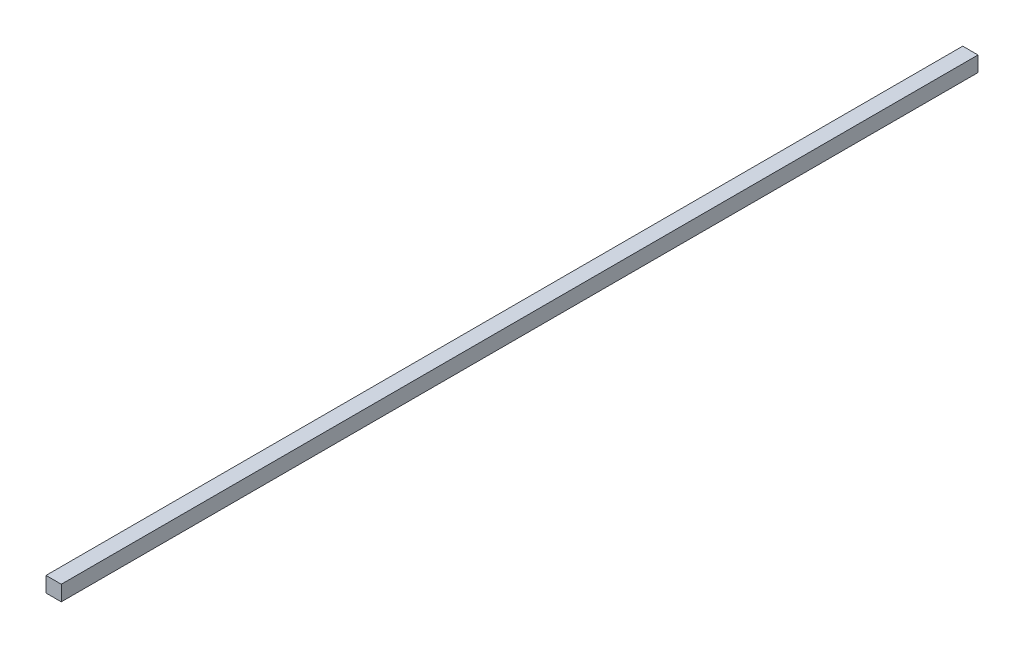
ISO-10303-21;
HEADER;
FILE_DESCRIPTION(('STEP AP214'),'2;1');
FILE_NAME('part.step','',(''),(''),'','','');
FILE_SCHEMA(('AUTOMOTIVE_DESIGN { 1 0 10303 214 1 1 1 1 }'));
ENDSEC;
DATA;
#1=APPLICATION_CONTEXT('core data for automotive mechanical design processes');
#2=APPLICATION_PROTOCOL_DEFINITION('international standard','automotive_design',2000,#1);
#3=PRODUCT_CONTEXT('',#1,'mechanical');
#4=PRODUCT('Part','Part','',(#3));
#5=PRODUCT_RELATED_PRODUCT_CATEGORY('part','',(#4));
#6=PRODUCT_DEFINITION_FORMATION('','',#4);
#7=PRODUCT_DEFINITION_CONTEXT('part definition',#1,'design');
#8=PRODUCT_DEFINITION('design','',#6,#7);
#9=PRODUCT_DEFINITION_SHAPE('','',#8);
#10=(LENGTH_UNIT() NAMED_UNIT(*) SI_UNIT(.MILLI.,.METRE.));
#11=(NAMED_UNIT(*) PLANE_ANGLE_UNIT() SI_UNIT($,.RADIAN.));
#12=(NAMED_UNIT(*) SI_UNIT($,.STERADIAN.) SOLID_ANGLE_UNIT());
#13=UNCERTAINTY_MEASURE_WITH_UNIT(LENGTH_MEASURE(1.E-05),#10,'distance_accuracy_value','');
#14=(GEOMETRIC_REPRESENTATION_CONTEXT(3) GLOBAL_UNCERTAINTY_ASSIGNED_CONTEXT((#13)) GLOBAL_UNIT_ASSIGNED_CONTEXT((#10,
#11,#12)) REPRESENTATION_CONTEXT('',''));
#15=CARTESIAN_POINT('',(0.,0.,0.));
#16=DIRECTION('',(0.,0.,1.));
#17=DIRECTION('',(1.,0.,0.));
#18=AXIS2_PLACEMENT_3D('',#15,#16,#17);
#19=CARTESIAN_POINT('',(0.,0.,600.));
#20=DIRECTION('',(1.,0.,0.));
#21=DIRECTION('',(0.,1.,0.));
#22=AXIS2_PLACEMENT_3D('',#19,#20,#21);
#23=PLANE('',#22);
#24=DIRECTION('',(0.,-1.,0.));
#25=VECTOR('',#24,1.);
#26=CARTESIAN_POINT('',(0.,0.,0.));
#27=LINE('',#26,#25);
#28=CARTESIAN_POINT('',(0.,0.,0.));
#29=VERTEX_POINT('',#28);
#30=CARTESIAN_POINT('',(0.,-10.,0.));
#31=VERTEX_POINT('',#30);
#32=EDGE_CURVE('E96',#29,#31,#27,.T.);
#33=ORIENTED_EDGE('',*,*,#32,.T.);
#34=DIRECTION('',(0.,0.,-1.));
#35=VECTOR('',#34,1.);
#36=CARTESIAN_POINT('',(0.,-10.,600.));
#37=LINE('',#36,#35);
#38=CARTESIAN_POINT('',(0.,-10.,600.));
#39=VERTEX_POINT('',#38);
#40=EDGE_CURVE('E11',#39,#31,#37,.T.);
#41=ORIENTED_EDGE('',*,*,#40,.F.);
#42=DIRECTION('',(0.,-1.,0.));
#43=VECTOR('',#42,1.);
#44=CARTESIAN_POINT('',(0.,0.,600.));
#45=LINE('',#44,#43);
#46=CARTESIAN_POINT('',(0.,0.,600.));
#47=VERTEX_POINT('',#46);
#48=EDGE_CURVE('E84',#47,#39,#45,.T.);
#49=ORIENTED_EDGE('',*,*,#48,.F.);
#50=DIRECTION('',(0.,0.,-1.));
#51=VECTOR('',#50,1.);
#52=CARTESIAN_POINT('',(0.,0.,600.));
#53=LINE('',#52,#51);
#54=EDGE_CURVE('E92',#47,#29,#53,.T.);
#55=ORIENTED_EDGE('',*,*,#54,.T.);
#56=EDGE_LOOP('',(#33,#41,#49,#55));
#57=FACE_BOUND('',#56,.T.);
#58=ADVANCED_FACE('F33',(#57),#23,.F.);
#59=CARTESIAN_POINT('',(0.,-10.,600.));
#60=DIRECTION('',(0.,1.,0.));
#61=DIRECTION('',(0.,0.,1.));
#62=AXIS2_PLACEMENT_3D('',#59,#60,#61);
#63=PLANE('',#62);
#64=DIRECTION('',(1.,0.,0.));
#65=VECTOR('',#64,1.);
#66=CARTESIAN_POINT('',(0.,-10.,0.));
#67=LINE('',#66,#65);
#68=CARTESIAN_POINT('',(10.,-10.,0.));
#69=VERTEX_POINT('',#68);
#70=EDGE_CURVE('E88',#31,#69,#67,.T.);
#71=ORIENTED_EDGE('',*,*,#70,.T.);
#72=DIRECTION('',(0.,0.,-1.));
#73=VECTOR('',#72,1.);
#74=CARTESIAN_POINT('',(10.,-10.,600.));
#75=LINE('',#74,#73);
#76=CARTESIAN_POINT('',(10.,-10.,600.));
#77=VERTEX_POINT('',#76);
#78=EDGE_CURVE('E41',#77,#69,#75,.T.);
#79=ORIENTED_EDGE('',*,*,#78,.F.);
#80=DIRECTION('',(1.,0.,0.));
#81=VECTOR('',#80,1.);
#82=CARTESIAN_POINT('',(0.,-10.,600.));
#83=LINE('',#82,#81);
#84=EDGE_CURVE('E79',#39,#77,#83,.T.);
#85=ORIENTED_EDGE('',*,*,#84,.F.);
#86=ORIENTED_EDGE('',*,*,#40,.T.);
#87=EDGE_LOOP('',(#71,#79,#85,#86));
#88=FACE_BOUND('',#87,.T.);
#89=ADVANCED_FACE('F87',(#88),#63,.F.);
#90=CARTESIAN_POINT('',(10.,0.,600.));
#91=DIRECTION('',(-1.,0.,0.));
#92=DIRECTION('',(0.,-1.,0.));
#93=AXIS2_PLACEMENT_3D('',#90,#91,#92);
#94=PLANE('',#93);
#95=DIRECTION('',(0.,1.,0.));
#96=VECTOR('',#95,1.);
#97=CARTESIAN_POINT('',(10.,0.,0.));
#98=LINE('',#97,#96);
#99=CARTESIAN_POINT('',(10.,0.,0.));
#100=VERTEX_POINT('',#99);
#101=EDGE_CURVE('E66',#69,#100,#98,.T.);
#102=ORIENTED_EDGE('',*,*,#101,.T.);
#103=DIRECTION('',(0.,0.,-1.));
#104=VECTOR('',#103,1.);
#105=CARTESIAN_POINT('',(10.,0.,600.));
#106=LINE('',#105,#104);
#107=CARTESIAN_POINT('',(10.,0.,600.));
#108=VERTEX_POINT('',#107);
#109=EDGE_CURVE('E89',#108,#100,#106,.T.);
#110=ORIENTED_EDGE('',*,*,#109,.F.);
#111=DIRECTION('',(0.,1.,0.));
#112=VECTOR('',#111,1.);
#113=CARTESIAN_POINT('',(10.,0.,600.));
#114=LINE('',#113,#112);
#115=EDGE_CURVE('E82',#77,#108,#114,.T.);
#116=ORIENTED_EDGE('',*,*,#115,.F.);
#117=ORIENTED_EDGE('',*,*,#78,.T.);
#118=EDGE_LOOP('',(#102,#110,#116,#117));
#119=FACE_BOUND('',#118,.T.);
#120=ADVANCED_FACE('F90',(#119),#94,.F.);
#121=CARTESIAN_POINT('',(0.,0.,600.));
#122=DIRECTION('',(0.,-1.,0.));
#123=DIRECTION('',(0.,0.,-1.));
#124=AXIS2_PLACEMENT_3D('',#121,#122,#123);
#125=PLANE('',#124);
#126=DIRECTION('',(-1.,0.,0.));
#127=VECTOR('',#126,1.);
#128=CARTESIAN_POINT('',(0.,0.,0.));
#129=LINE('',#128,#127);
#130=EDGE_CURVE('E72',#100,#29,#129,.T.);
#131=ORIENTED_EDGE('',*,*,#130,.T.);
#132=ORIENTED_EDGE('',*,*,#54,.F.);
#133=DIRECTION('',(-1.,0.,0.));
#134=VECTOR('',#133,1.);
#135=CARTESIAN_POINT('',(0.,0.,600.));
#136=LINE('',#135,#134);
#137=EDGE_CURVE('E49',#108,#47,#136,.T.);
#138=ORIENTED_EDGE('',*,*,#137,.F.);
#139=ORIENTED_EDGE('',*,*,#109,.T.);
#140=EDGE_LOOP('',(#131,#132,#138,#139));
#141=FACE_BOUND('',#140,.T.);
#142=ADVANCED_FACE('F103',(#141),#125,.F.);
#143=CARTESIAN_POINT('',(0.,0.,600.));
#144=DIRECTION('',(0.,0.,1.));
#145=DIRECTION('',(1.,0.,0.));
#146=AXIS2_PLACEMENT_3D('',#143,#144,#145);
#147=PLANE('',#146);
#148=ORIENTED_EDGE('',*,*,#48,.T.);
#149=ORIENTED_EDGE('',*,*,#84,.T.);
#150=ORIENTED_EDGE('',*,*,#115,.T.);
#151=ORIENTED_EDGE('',*,*,#137,.T.);
#152=EDGE_LOOP('',(#148,#149,#150,#151));
#153=FACE_BOUND('',#152,.T.);
#154=ADVANCED_FACE('F80',(#153),#147,.T.);
#155=CARTESIAN_POINT('',(0.,0.,0.));
#156=DIRECTION('',(0.,0.,1.));
#157=DIRECTION('',(1.,0.,0.));
#158=AXIS2_PLACEMENT_3D('',#155,#156,#157);
#159=PLANE('',#158);
#160=ORIENTED_EDGE('',*,*,#32,.F.);
#161=ORIENTED_EDGE('',*,*,#130,.F.);
#162=ORIENTED_EDGE('',*,*,#101,.F.);
#163=ORIENTED_EDGE('',*,*,#70,.F.);
#164=EDGE_LOOP('',(#160,#161,#162,#163));
#165=FACE_BOUND('',#164,.T.);
#166=ADVANCED_FACE('F106',(#165),#159,.F.);
#167=CLOSED_SHELL('',(#58,#89,#120,#142,#154,#166));
#168=MANIFOLD_SOLID_BREP('B2',#167);
#169=ADVANCED_BREP_SHAPE_REPRESENTATION('',(#18,#168),#14);
#170=SHAPE_DEFINITION_REPRESENTATION(#9,#169);
ENDSEC;
END-ISO-10303-21;
